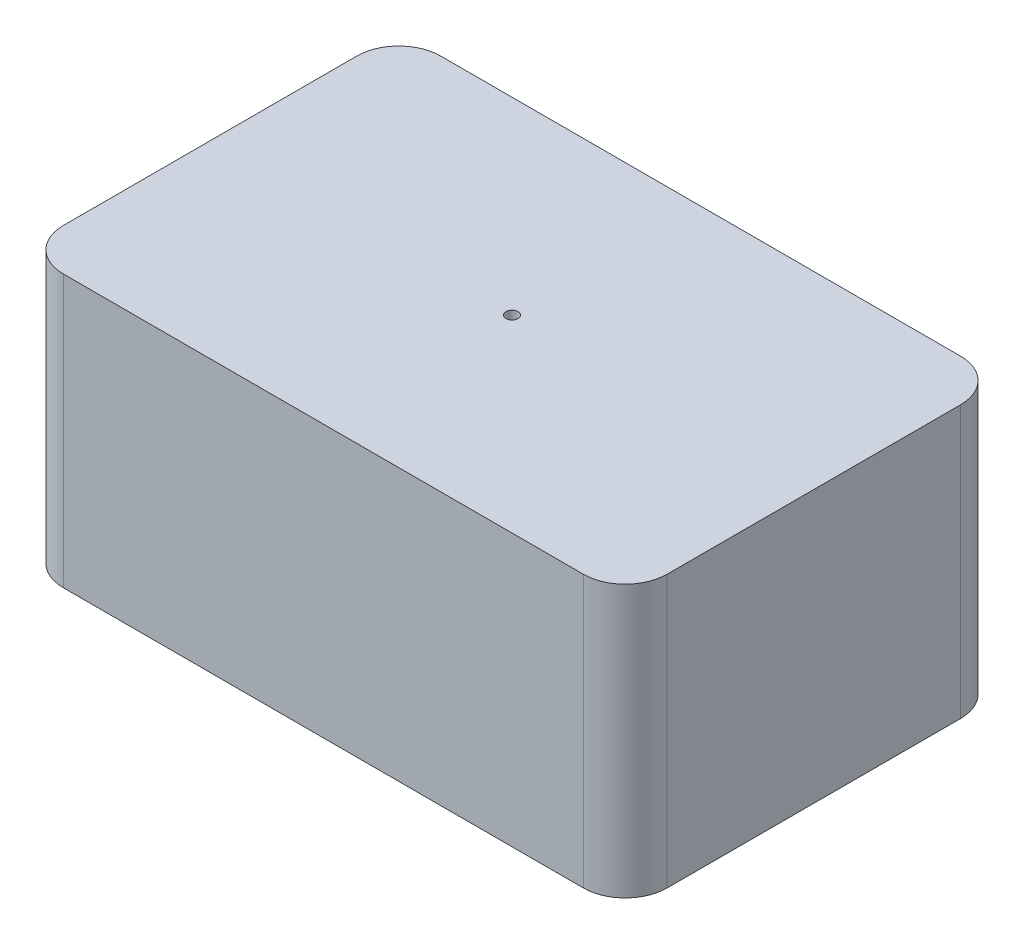
ISO-10303-21;
HEADER;
FILE_DESCRIPTION(('STEP AP214'),'2;1');
FILE_NAME('part.step','',(''),(''),'','','');
FILE_SCHEMA(('AUTOMOTIVE_DESIGN { 1 0 10303 214 1 1 1 1 }'));
ENDSEC;
DATA;
#1=APPLICATION_CONTEXT('core data for automotive mechanical design processes');
#2=APPLICATION_PROTOCOL_DEFINITION('international standard','automotive_design',2000,#1);
#3=PRODUCT_CONTEXT('',#1,'mechanical');
#4=PRODUCT('Part','Part','',(#3));
#5=PRODUCT_RELATED_PRODUCT_CATEGORY('part','',(#4));
#6=PRODUCT_DEFINITION_FORMATION('','',#4);
#7=PRODUCT_DEFINITION_CONTEXT('part definition',#1,'design');
#8=PRODUCT_DEFINITION('design','',#6,#7);
#9=PRODUCT_DEFINITION_SHAPE('','',#8);
#10=(LENGTH_UNIT() NAMED_UNIT(*) SI_UNIT(.MILLI.,.METRE.));
#11=(NAMED_UNIT(*) PLANE_ANGLE_UNIT() SI_UNIT($,.RADIAN.));
#12=(NAMED_UNIT(*) SI_UNIT($,.STERADIAN.) SOLID_ANGLE_UNIT());
#13=UNCERTAINTY_MEASURE_WITH_UNIT(LENGTH_MEASURE(1.E-05),#10,'distance_accuracy_value','');
#14=(GEOMETRIC_REPRESENTATION_CONTEXT(3) GLOBAL_UNCERTAINTY_ASSIGNED_CONTEXT((#13)) GLOBAL_UNIT_ASSIGNED_CONTEXT((#10,
#11,#12)) REPRESENTATION_CONTEXT('',''));
#15=CARTESIAN_POINT('',(0.,0.,0.));
#16=DIRECTION('',(0.,0.,1.));
#17=DIRECTION('',(1.,0.,0.));
#18=AXIS2_PLACEMENT_3D('',#15,#16,#17);
#19=CARTESIAN_POINT('',(0.,18.,0.));
#20=DIRECTION('',(0.,-1.,0.));
#21=DIRECTION('',(0.,0.,-1.));
#22=AXIS2_PLACEMENT_3D('',#19,#20,#21);
#23=CYLINDRICAL_SURFACE('',#22,0.4);
#24=CARTESIAN_POINT('',(0.,18.,0.));
#25=DIRECTION('',(0.,1.,0.));
#26=DIRECTION('',(0.,0.,1.));
#27=AXIS2_PLACEMENT_3D('',#24,#25,#26);
#28=CIRCLE('',#27,0.4);
#29=CARTESIAN_POINT('',(0.,18.,0.4));
#30=VERTEX_POINT('',#29);
#31=EDGE_CURVE('E160',#30,#30,#28,.T.);
#32=ORIENTED_EDGE('',*,*,#31,.T.);
#33=EDGE_LOOP('',(#32));
#34=FACE_BOUND('',#33,.T.);
#35=CARTESIAN_POINT('',(0.,17.,0.));
#36=DIRECTION('',(0.,-1.,0.));
#37=DIRECTION('',(0.,0.,-1.));
#38=AXIS2_PLACEMENT_3D('',#35,#36,#37);
#39=CIRCLE('',#38,0.4);
#40=CARTESIAN_POINT('',(0.,17.,-0.4));
#41=VERTEX_POINT('',#40);
#42=EDGE_CURVE('E43',#41,#41,#39,.T.);
#43=ORIENTED_EDGE('',*,*,#42,.T.);
#44=EDGE_LOOP('',(#43));
#45=FACE_BOUND('',#44,.T.);
#46=ADVANCED_FACE('F39',(#34,#45),#23,.F.);
#47=CARTESIAN_POINT('',(17.2231656762451,18.,-9.72316567624512));
#48=DIRECTION('',(0.,-1.,0.));
#49=DIRECTION('',(0.,0.,-1.));
#50=AXIS2_PLACEMENT_3D('',#47,#48,#49);
#51=PLANE('',#50);
#52=CARTESIAN_POINT('',(17.2231656762451,18.,-9.72316567624512));
#53=DIRECTION('',(0.,1.,0.));
#54=DIRECTION('',(0.,0.,-1.));
#55=AXIS2_PLACEMENT_3D('',#52,#53,#54);
#56=CIRCLE('',#55,2.77683432375488);
#57=CARTESIAN_POINT('',(20.,18.,-9.72316567624512));
#58=VERTEX_POINT('',#57);
#59=CARTESIAN_POINT('',(17.2231656762451,18.,-12.5));
#60=VERTEX_POINT('',#59);
#61=EDGE_CURVE('E179',#58,#60,#56,.T.);
#62=ORIENTED_EDGE('',*,*,#61,.T.);
#63=DIRECTION('',(-1.,0.,0.));
#64=VECTOR('',#63,1.);
#65=CARTESIAN_POINT('',(-17.2231656762451,18.,-12.5));
#66=LINE('',#65,#64);
#67=CARTESIAN_POINT('',(-17.2231656762451,18.,-12.5));
#68=VERTEX_POINT('',#67);
#69=EDGE_CURVE('E106',#60,#68,#66,.T.);
#70=ORIENTED_EDGE('',*,*,#69,.T.);
#71=CARTESIAN_POINT('',(-17.2231656762451,18.,-9.72316567624511));
#72=DIRECTION('',(0.,1.,0.));
#73=DIRECTION('',(0.,0.,1.));
#74=AXIS2_PLACEMENT_3D('',#71,#72,#73);
#75=CIRCLE('',#74,2.77683432375489);
#76=CARTESIAN_POINT('',(-20.,18.,-9.72316567624511));
#77=VERTEX_POINT('',#76);
#78=EDGE_CURVE('E201',#68,#77,#75,.T.);
#79=ORIENTED_EDGE('',*,*,#78,.T.);
#80=DIRECTION('',(0.,0.,1.));
#81=VECTOR('',#80,1.);
#82=CARTESIAN_POINT('',(-20.,18.,-9.72316567624511));
#83=LINE('',#82,#81);
#84=CARTESIAN_POINT('',(-20.,18.,9.72316567624511));
#85=VERTEX_POINT('',#84);
#86=EDGE_CURVE('E214',#77,#85,#83,.T.);
#87=ORIENTED_EDGE('',*,*,#86,.T.);
#88=CARTESIAN_POINT('',(-17.2231656762451,18.,9.72316567624511));
#89=DIRECTION('',(0.,1.,0.));
#90=DIRECTION('',(0.,0.,-1.));
#91=AXIS2_PLACEMENT_3D('',#88,#89,#90);
#92=CIRCLE('',#91,2.77683432375488);
#93=CARTESIAN_POINT('',(-17.2231656762451,18.,12.5));
#94=VERTEX_POINT('',#93);
#95=EDGE_CURVE('E130',#85,#94,#92,.T.);
#96=ORIENTED_EDGE('',*,*,#95,.T.);
#97=DIRECTION('',(1.,0.,0.));
#98=VECTOR('',#97,1.);
#99=CARTESIAN_POINT('',(17.2231656762451,18.,12.5));
#100=LINE('',#99,#98);
#101=CARTESIAN_POINT('',(17.2231656762451,18.,12.5));
#102=VERTEX_POINT('',#101);
#103=EDGE_CURVE('E122',#94,#102,#100,.T.);
#104=ORIENTED_EDGE('',*,*,#103,.T.);
#105=CARTESIAN_POINT('',(17.2231656762451,18.,9.72316567624511));
#106=DIRECTION('',(0.,1.,0.));
#107=DIRECTION('',(0.,0.,1.));
#108=AXIS2_PLACEMENT_3D('',#105,#106,#107);
#109=CIRCLE('',#108,2.77683432375489);
#110=CARTESIAN_POINT('',(20.,18.,9.72316567624511));
#111=VERTEX_POINT('',#110);
#112=EDGE_CURVE('E127',#102,#111,#109,.T.);
#113=ORIENTED_EDGE('',*,*,#112,.T.);
#114=DIRECTION('',(0.,0.,-1.));
#115=VECTOR('',#114,1.);
#116=CARTESIAN_POINT('',(20.,18.,-9.72316567624512));
#117=LINE('',#116,#115);
#118=EDGE_CURVE('E65',#111,#58,#117,.T.);
#119=ORIENTED_EDGE('',*,*,#118,.T.);
#120=EDGE_LOOP('',(#62,#70,#79,#87,#96,#104,#113,#119));
#121=FACE_BOUND('',#120,.T.);
#122=ORIENTED_EDGE('',*,*,#31,.F.);
#123=EDGE_LOOP('',(#122));
#124=FACE_BOUND('',#123,.T.);
#125=ADVANCED_FACE('F124',(#121,#124),#51,.F.);
#126=CARTESIAN_POINT('',(17.2231656762451,0.,-9.72316567624512));
#127=DIRECTION('',(0.,-1.,0.));
#128=DIRECTION('',(0.,0.,-1.));
#129=AXIS2_PLACEMENT_3D('',#126,#127,#128);
#130=PLANE('',#129);
#131=DIRECTION('',(1.,0.,0.));
#132=VECTOR('',#131,1.);
#133=CARTESIAN_POINT('',(-17.2231656762451,0.,-11.5));
#134=LINE('',#133,#132);
#135=CARTESIAN_POINT('',(-17.2231656762451,0.,-11.5));
#136=VERTEX_POINT('',#135);
#137=CARTESIAN_POINT('',(17.2231656762451,0.,-11.5));
#138=VERTEX_POINT('',#137);
#139=EDGE_CURVE('E56',#136,#138,#134,.T.);
#140=ORIENTED_EDGE('',*,*,#139,.F.);
#141=CARTESIAN_POINT('',(-17.2231656762451,0.,-9.72316567624511));
#142=DIRECTION('',(0.,-1.,0.));
#143=DIRECTION('',(0.,0.,-1.));
#144=AXIS2_PLACEMENT_3D('',#141,#142,#143);
#145=CIRCLE('',#144,1.77683432375489);
#146=CARTESIAN_POINT('',(-19.,0.,-9.72316567624511));
#147=VERTEX_POINT('',#146);
#148=EDGE_CURVE('E258',#147,#136,#145,.T.);
#149=ORIENTED_EDGE('',*,*,#148,.F.);
#150=DIRECTION('',(0.,0.,-1.));
#151=VECTOR('',#150,1.);
#152=CARTESIAN_POINT('',(-19.,0.,9.72316567624511));
#153=LINE('',#152,#151);
#154=CARTESIAN_POINT('',(-19.,0.,9.72316567624511));
#155=VERTEX_POINT('',#154);
#156=EDGE_CURVE('E263',#155,#147,#153,.T.);
#157=ORIENTED_EDGE('',*,*,#156,.F.);
#158=CARTESIAN_POINT('',(-17.2231656762451,0.,9.72316567624511));
#159=DIRECTION('',(0.,-1.,0.));
#160=DIRECTION('',(0.,0.,-1.));
#161=AXIS2_PLACEMENT_3D('',#158,#159,#160);
#162=CIRCLE('',#161,1.77683432375489);
#163=CARTESIAN_POINT('',(-17.2231656762451,0.,11.5));
#164=VERTEX_POINT('',#163);
#165=EDGE_CURVE('E267',#164,#155,#162,.T.);
#166=ORIENTED_EDGE('',*,*,#165,.F.);
#167=DIRECTION('',(-1.,0.,0.));
#168=VECTOR('',#167,1.);
#169=CARTESIAN_POINT('',(17.2231656762451,0.,11.5));
#170=LINE('',#169,#168);
#171=CARTESIAN_POINT('',(17.2231656762451,0.,11.5));
#172=VERTEX_POINT('',#171);
#173=EDGE_CURVE('E271',#172,#164,#170,.T.);
#174=ORIENTED_EDGE('',*,*,#173,.F.);
#175=CARTESIAN_POINT('',(17.2231656762451,0.,9.72316567624511));
#176=DIRECTION('',(0.,-1.,0.));
#177=DIRECTION('',(0.,0.,-1.));
#178=AXIS2_PLACEMENT_3D('',#175,#176,#177);
#179=CIRCLE('',#178,1.77683432375488);
#180=CARTESIAN_POINT('',(19.,0.,9.72316567624511));
#181=VERTEX_POINT('',#180);
#182=EDGE_CURVE('E275',#181,#172,#179,.T.);
#183=ORIENTED_EDGE('',*,*,#182,.F.);
#184=DIRECTION('',(0.,0.,1.));
#185=VECTOR('',#184,1.);
#186=CARTESIAN_POINT('',(19.,0.,-9.72316567624512));
#187=LINE('',#186,#185);
#188=CARTESIAN_POINT('',(19.,0.,-9.72316567624512));
#189=VERTEX_POINT('',#188);
#190=EDGE_CURVE('E279',#189,#181,#187,.T.);
#191=ORIENTED_EDGE('',*,*,#190,.F.);
#192=CARTESIAN_POINT('',(17.2231656762451,0.,-9.72316567624512));
#193=DIRECTION('',(0.,-1.,0.));
#194=DIRECTION('',(0.,0.,-1.));
#195=AXIS2_PLACEMENT_3D('',#192,#193,#194);
#196=CIRCLE('',#195,1.77683432375488);
#197=EDGE_CURVE('E283',#138,#189,#196,.T.);
#198=ORIENTED_EDGE('',*,*,#197,.F.);
#199=EDGE_LOOP('',(#140,#149,#157,#166,#174,#183,#191,#198));
#200=FACE_BOUND('',#199,.T.);
#201=CARTESIAN_POINT('',(17.2231656762451,0.,-9.72316567624512));
#202=DIRECTION('',(0.,1.,0.));
#203=DIRECTION('',(0.,0.,-1.));
#204=AXIS2_PLACEMENT_3D('',#201,#202,#203);
#205=CIRCLE('',#204,2.77683432375488);
#206=CARTESIAN_POINT('',(20.,0.,-9.72316567624512));
#207=VERTEX_POINT('',#206);
#208=CARTESIAN_POINT('',(17.2231656762451,0.,-12.5));
#209=VERTEX_POINT('',#208);
#210=EDGE_CURVE('E155',#207,#209,#205,.T.);
#211=ORIENTED_EDGE('',*,*,#210,.F.);
#212=DIRECTION('',(0.,0.,-1.));
#213=VECTOR('',#212,1.);
#214=CARTESIAN_POINT('',(20.,0.,-9.72316567624512));
#215=LINE('',#214,#213);
#216=CARTESIAN_POINT('',(20.,0.,9.72316567624511));
#217=VERTEX_POINT('',#216);
#218=EDGE_CURVE('E98',#217,#207,#215,.T.);
#219=ORIENTED_EDGE('',*,*,#218,.F.);
#220=CARTESIAN_POINT('',(17.2231656762451,0.,9.72316567624511));
#221=DIRECTION('',(0.,1.,0.));
#222=DIRECTION('',(0.,0.,1.));
#223=AXIS2_PLACEMENT_3D('',#220,#221,#222);
#224=CIRCLE('',#223,2.77683432375489);
#225=CARTESIAN_POINT('',(17.2231656762451,0.,12.5));
#226=VERTEX_POINT('',#225);
#227=EDGE_CURVE('E174',#226,#217,#224,.T.);
#228=ORIENTED_EDGE('',*,*,#227,.F.);
#229=DIRECTION('',(1.,0.,0.));
#230=VECTOR('',#229,1.);
#231=CARTESIAN_POINT('',(17.2231656762451,0.,12.5));
#232=LINE('',#231,#230);
#233=CARTESIAN_POINT('',(-17.2231656762451,0.,12.5));
#234=VERTEX_POINT('',#233);
#235=EDGE_CURVE('E140',#234,#226,#232,.T.);
#236=ORIENTED_EDGE('',*,*,#235,.F.);
#237=CARTESIAN_POINT('',(-17.2231656762451,0.,9.72316567624511));
#238=DIRECTION('',(0.,1.,0.));
#239=DIRECTION('',(0.,0.,-1.));
#240=AXIS2_PLACEMENT_3D('',#237,#238,#239);
#241=CIRCLE('',#240,2.77683432375488);
#242=CARTESIAN_POINT('',(-20.,0.,9.72316567624511));
#243=VERTEX_POINT('',#242);
#244=EDGE_CURVE('E169',#243,#234,#241,.T.);
#245=ORIENTED_EDGE('',*,*,#244,.F.);
#246=DIRECTION('',(0.,0.,1.));
#247=VECTOR('',#246,1.);
#248=CARTESIAN_POINT('',(-20.,0.,-9.72316567624511));
#249=LINE('',#248,#247);
#250=CARTESIAN_POINT('',(-20.,0.,-9.72316567624511));
#251=VERTEX_POINT('',#250);
#252=EDGE_CURVE('E166',#251,#243,#249,.T.);
#253=ORIENTED_EDGE('',*,*,#252,.F.);
#254=CARTESIAN_POINT('',(-17.2231656762451,0.,-9.72316567624511));
#255=DIRECTION('',(0.,1.,0.));
#256=DIRECTION('',(0.,0.,1.));
#257=AXIS2_PLACEMENT_3D('',#254,#255,#256);
#258=CIRCLE('',#257,2.77683432375489);
#259=CARTESIAN_POINT('',(-17.2231656762451,0.,-12.5));
#260=VERTEX_POINT('',#259);
#261=EDGE_CURVE('E163',#260,#251,#258,.T.);
#262=ORIENTED_EDGE('',*,*,#261,.F.);
#263=DIRECTION('',(-1.,0.,0.));
#264=VECTOR('',#263,1.);
#265=CARTESIAN_POINT('',(-17.2231656762451,0.,-12.5));
#266=LINE('',#265,#264);
#267=EDGE_CURVE('E159',#209,#260,#266,.T.);
#268=ORIENTED_EDGE('',*,*,#267,.F.);
#269=EDGE_LOOP('',(#211,#219,#228,#236,#245,#253,#262,#268));
#270=FACE_BOUND('',#269,.T.);
#271=ADVANCED_FACE('F205',(#200,#270),#130,.T.);
#272=CARTESIAN_POINT('',(17.2231656762451,18.,-9.72316567624512));
#273=DIRECTION('',(0.,-1.,0.));
#274=DIRECTION('',(0.,0.,-1.));
#275=AXIS2_PLACEMENT_3D('',#272,#273,#274);
#276=CYLINDRICAL_SURFACE('',#275,2.77683432375488);
#277=ORIENTED_EDGE('',*,*,#210,.T.);
#278=DIRECTION('',(0.,-1.,0.));
#279=VECTOR('',#278,1.);
#280=CARTESIAN_POINT('',(17.2231656762451,18.,-12.5));
#281=LINE('',#280,#279);
#282=EDGE_CURVE('E11',#60,#209,#281,.T.);
#283=ORIENTED_EDGE('',*,*,#282,.F.);
#284=ORIENTED_EDGE('',*,*,#61,.F.);
#285=DIRECTION('',(0.,-1.,0.));
#286=VECTOR('',#285,1.);
#287=CARTESIAN_POINT('',(20.,18.,-9.72316567624512));
#288=LINE('',#287,#286);
#289=EDGE_CURVE('E151',#58,#207,#288,.T.);
#290=ORIENTED_EDGE('',*,*,#289,.T.);
#291=EDGE_LOOP('',(#277,#283,#284,#290));
#292=FACE_BOUND('',#291,.T.);
#293=ADVANCED_FACE('F41',(#292),#276,.T.);
#294=CARTESIAN_POINT('',(-17.2231656762451,18.,-12.5));
#295=DIRECTION('',(0.,0.,1.));
#296=DIRECTION('',(1.,0.,0.));
#297=AXIS2_PLACEMENT_3D('',#294,#295,#296);
#298=PLANE('',#297);
#299=ORIENTED_EDGE('',*,*,#267,.T.);
#300=DIRECTION('',(0.,-1.,0.));
#301=VECTOR('',#300,1.);
#302=CARTESIAN_POINT('',(-17.2231656762451,18.,-12.5));
#303=LINE('',#302,#301);
#304=EDGE_CURVE('E49',#68,#260,#303,.T.);
#305=ORIENTED_EDGE('',*,*,#304,.F.);
#306=ORIENTED_EDGE('',*,*,#69,.F.);
#307=ORIENTED_EDGE('',*,*,#282,.T.);
#308=EDGE_LOOP('',(#299,#305,#306,#307));
#309=FACE_BOUND('',#308,.T.);
#310=ADVANCED_FACE('F417',(#309),#298,.F.);
#311=CARTESIAN_POINT('',(-17.2231656762451,18.,-9.72316567624511));
#312=DIRECTION('',(0.,-1.,0.));
#313=DIRECTION('',(0.,0.,-1.));
#314=AXIS2_PLACEMENT_3D('',#311,#312,#313);
#315=CYLINDRICAL_SURFACE('',#314,2.77683432375489);
#316=ORIENTED_EDGE('',*,*,#261,.T.);
#317=DIRECTION('',(0.,-1.,0.));
#318=VECTOR('',#317,1.);
#319=CARTESIAN_POINT('',(-20.,18.,-9.72316567624511));
#320=LINE('',#319,#318);
#321=EDGE_CURVE('E190',#77,#251,#320,.T.);
#322=ORIENTED_EDGE('',*,*,#321,.F.);
#323=ORIENTED_EDGE('',*,*,#78,.F.);
#324=ORIENTED_EDGE('',*,*,#304,.T.);
#325=EDGE_LOOP('',(#316,#322,#323,#324));
#326=FACE_BOUND('',#325,.T.);
#327=ADVANCED_FACE('F199',(#326),#315,.T.);
#328=CARTESIAN_POINT('',(-20.,18.,-9.72316567624511));
#329=DIRECTION('',(1.,0.,0.));
#330=DIRECTION('',(0.,0.,-1.));
#331=AXIS2_PLACEMENT_3D('',#328,#329,#330);
#332=PLANE('',#331);
#333=ORIENTED_EDGE('',*,*,#252,.T.);
#334=DIRECTION('',(0.,-1.,0.));
#335=VECTOR('',#334,1.);
#336=CARTESIAN_POINT('',(-20.,18.,9.72316567624511));
#337=LINE('',#336,#335);
#338=EDGE_CURVE('E186',#85,#243,#337,.T.);
#339=ORIENTED_EDGE('',*,*,#338,.F.);
#340=ORIENTED_EDGE('',*,*,#86,.F.);
#341=ORIENTED_EDGE('',*,*,#321,.T.);
#342=EDGE_LOOP('',(#333,#339,#340,#341));
#343=FACE_BOUND('',#342,.T.);
#344=ADVANCED_FACE('F209',(#343),#332,.F.);
#345=CARTESIAN_POINT('',(-17.2231656762451,18.,9.72316567624511));
#346=DIRECTION('',(0.,-1.,0.));
#347=DIRECTION('',(0.,0.,-1.));
#348=AXIS2_PLACEMENT_3D('',#345,#346,#347);
#349=CYLINDRICAL_SURFACE('',#348,2.77683432375488);
#350=ORIENTED_EDGE('',*,*,#244,.T.);
#351=DIRECTION('',(0.,-1.,0.));
#352=VECTOR('',#351,1.);
#353=CARTESIAN_POINT('',(-17.2231656762451,18.,12.5));
#354=LINE('',#353,#352);
#355=EDGE_CURVE('E144',#94,#234,#354,.T.);
#356=ORIENTED_EDGE('',*,*,#355,.F.);
#357=ORIENTED_EDGE('',*,*,#95,.F.);
#358=ORIENTED_EDGE('',*,*,#338,.T.);
#359=EDGE_LOOP('',(#350,#356,#357,#358));
#360=FACE_BOUND('',#359,.T.);
#361=ADVANCED_FACE('F212',(#360),#349,.T.);
#362=CARTESIAN_POINT('',(17.2231656762451,18.,12.5));
#363=DIRECTION('',(0.,0.,-1.));
#364=DIRECTION('',(-1.,0.,0.));
#365=AXIS2_PLACEMENT_3D('',#362,#363,#364);
#366=PLANE('',#365);
#367=ORIENTED_EDGE('',*,*,#235,.T.);
#368=DIRECTION('',(0.,-1.,0.));
#369=VECTOR('',#368,1.);
#370=CARTESIAN_POINT('',(17.2231656762451,18.,12.5));
#371=LINE('',#370,#369);
#372=EDGE_CURVE('E137',#102,#226,#371,.T.);
#373=ORIENTED_EDGE('',*,*,#372,.F.);
#374=ORIENTED_EDGE('',*,*,#103,.F.);
#375=ORIENTED_EDGE('',*,*,#355,.T.);
#376=EDGE_LOOP('',(#367,#373,#374,#375));
#377=FACE_BOUND('',#376,.T.);
#378=ADVANCED_FACE('F138',(#377),#366,.F.);
#379=CARTESIAN_POINT('',(17.2231656762451,18.,9.72316567624511));
#380=DIRECTION('',(0.,-1.,0.));
#381=DIRECTION('',(0.,0.,-1.));
#382=AXIS2_PLACEMENT_3D('',#379,#380,#381);
#383=CYLINDRICAL_SURFACE('',#382,2.77683432375489);
#384=ORIENTED_EDGE('',*,*,#227,.T.);
#385=DIRECTION('',(0.,-1.,0.));
#386=VECTOR('',#385,1.);
#387=CARTESIAN_POINT('',(20.,18.,9.72316567624511));
#388=LINE('',#387,#386);
#389=EDGE_CURVE('E145',#111,#217,#388,.T.);
#390=ORIENTED_EDGE('',*,*,#389,.F.);
#391=ORIENTED_EDGE('',*,*,#112,.F.);
#392=ORIENTED_EDGE('',*,*,#372,.T.);
#393=EDGE_LOOP('',(#384,#390,#391,#392));
#394=FACE_BOUND('',#393,.T.);
#395=ADVANCED_FACE('F147',(#394),#383,.T.);
#396=CARTESIAN_POINT('',(20.,18.,-9.72316567624512));
#397=DIRECTION('',(-1.,0.,0.));
#398=DIRECTION('',(0.,0.,1.));
#399=AXIS2_PLACEMENT_3D('',#396,#397,#398);
#400=PLANE('',#399);
#401=ORIENTED_EDGE('',*,*,#218,.T.);
#402=ORIENTED_EDGE('',*,*,#289,.F.);
#403=ORIENTED_EDGE('',*,*,#118,.F.);
#404=ORIENTED_EDGE('',*,*,#389,.T.);
#405=EDGE_LOOP('',(#401,#402,#403,#404));
#406=FACE_BOUND('',#405,.T.);
#407=ADVANCED_FACE('F405',(#406),#400,.F.);
#408=CARTESIAN_POINT('',(-17.2231656762451,17.,-11.5));
#409=DIRECTION('',(0.,0.,-1.));
#410=DIRECTION('',(-1.,0.,0.));
#411=AXIS2_PLACEMENT_3D('',#408,#409,#410);
#412=PLANE('',#411);
#413=ORIENTED_EDGE('',*,*,#139,.T.);
#414=DIRECTION('',(0.,-1.,0.));
#415=VECTOR('',#414,1.);
#416=CARTESIAN_POINT('',(17.2231656762451,17.,-11.5));
#417=LINE('',#416,#415);
#418=CARTESIAN_POINT('',(17.2231656762451,17.,-11.5));
#419=VERTEX_POINT('',#418);
#420=EDGE_CURVE('E227',#419,#138,#417,.T.);
#421=ORIENTED_EDGE('',*,*,#420,.F.);
#422=DIRECTION('',(1.,0.,0.));
#423=VECTOR('',#422,1.);
#424=CARTESIAN_POINT('',(-17.2231656762451,17.,-11.5));
#425=LINE('',#424,#423);
#426=CARTESIAN_POINT('',(-17.2231656762451,17.,-11.5));
#427=VERTEX_POINT('',#426);
#428=EDGE_CURVE('E262',#427,#419,#425,.T.);
#429=ORIENTED_EDGE('',*,*,#428,.F.);
#430=DIRECTION('',(0.,-1.,0.));
#431=VECTOR('',#430,1.);
#432=CARTESIAN_POINT('',(-17.2231656762451,17.,-11.5));
#433=LINE('',#432,#431);
#434=EDGE_CURVE('E255',#427,#136,#433,.T.);
#435=ORIENTED_EDGE('',*,*,#434,.T.);
#436=EDGE_LOOP('',(#413,#421,#429,#435));
#437=FACE_BOUND('',#436,.T.);
#438=ADVANCED_FACE('F326',(#437),#412,.F.);
#439=CARTESIAN_POINT('',(-17.2231656762451,17.,-9.72316567624511));
#440=DIRECTION('',(0.,-1.,0.));
#441=DIRECTION('',(0.,0.,-1.));
#442=AXIS2_PLACEMENT_3D('',#439,#440,#441);
#443=CYLINDRICAL_SURFACE('',#442,1.77683432375489);
#444=ORIENTED_EDGE('',*,*,#148,.T.);
#445=ORIENTED_EDGE('',*,*,#434,.F.);
#446=CARTESIAN_POINT('',(-17.2231656762451,17.,-9.72316567624511));
#447=DIRECTION('',(0.,-1.,0.));
#448=DIRECTION('',(0.,0.,-1.));
#449=AXIS2_PLACEMENT_3D('',#446,#447,#448);
#450=CIRCLE('',#449,1.77683432375489);
#451=CARTESIAN_POINT('',(-19.,17.,-9.72316567624511));
#452=VERTEX_POINT('',#451);
#453=EDGE_CURVE('E231',#452,#427,#450,.T.);
#454=ORIENTED_EDGE('',*,*,#453,.F.);
#455=DIRECTION('',(0.,-1.,0.));
#456=VECTOR('',#455,1.);
#457=CARTESIAN_POINT('',(-19.,17.,-9.72316567624511));
#458=LINE('',#457,#456);
#459=EDGE_CURVE('E251',#452,#147,#458,.T.);
#460=ORIENTED_EDGE('',*,*,#459,.T.);
#461=EDGE_LOOP('',(#444,#445,#454,#460));
#462=FACE_BOUND('',#461,.T.);
#463=ADVANCED_FACE('F346',(#462),#443,.F.);
#464=CARTESIAN_POINT('',(-19.,17.,9.72316567624511));
#465=DIRECTION('',(-1.,0.,0.));
#466=DIRECTION('',(0.,0.,1.));
#467=AXIS2_PLACEMENT_3D('',#464,#465,#466);
#468=PLANE('',#467);
#469=ORIENTED_EDGE('',*,*,#156,.T.);
#470=ORIENTED_EDGE('',*,*,#459,.F.);
#471=DIRECTION('',(0.,0.,-1.));
#472=VECTOR('',#471,1.);
#473=CARTESIAN_POINT('',(-19.,17.,9.72316567624511));
#474=LINE('',#473,#472);
#475=CARTESIAN_POINT('',(-19.,17.,9.72316567624511));
#476=VERTEX_POINT('',#475);
#477=EDGE_CURVE('E292',#476,#452,#474,.T.);
#478=ORIENTED_EDGE('',*,*,#477,.F.);
#479=DIRECTION('',(0.,-1.,0.));
#480=VECTOR('',#479,1.);
#481=CARTESIAN_POINT('',(-19.,17.,9.72316567624511));
#482=LINE('',#481,#480);
#483=EDGE_CURVE('E247',#476,#155,#482,.T.);
#484=ORIENTED_EDGE('',*,*,#483,.T.);
#485=EDGE_LOOP('',(#469,#470,#478,#484));
#486=FACE_BOUND('',#485,.T.);
#487=ADVANCED_FACE('F351',(#486),#468,.F.);
#488=CARTESIAN_POINT('',(-17.2231656762451,17.,9.72316567624511));
#489=DIRECTION('',(0.,-1.,0.));
#490=DIRECTION('',(0.,0.,-1.));
#491=AXIS2_PLACEMENT_3D('',#488,#489,#490);
#492=CYLINDRICAL_SURFACE('',#491,1.77683432375489);
#493=ORIENTED_EDGE('',*,*,#165,.T.);
#494=ORIENTED_EDGE('',*,*,#483,.F.);
#495=CARTESIAN_POINT('',(-17.2231656762451,17.,9.72316567624511));
#496=DIRECTION('',(0.,-1.,0.));
#497=DIRECTION('',(0.,0.,-1.));
#498=AXIS2_PLACEMENT_3D('',#495,#496,#497);
#499=CIRCLE('',#498,1.77683432375489);
#500=CARTESIAN_POINT('',(-17.2231656762451,17.,11.5));
#501=VERTEX_POINT('',#500);
#502=EDGE_CURVE('E296',#501,#476,#499,.T.);
#503=ORIENTED_EDGE('',*,*,#502,.F.);
#504=DIRECTION('',(0.,-1.,0.));
#505=VECTOR('',#504,1.);
#506=CARTESIAN_POINT('',(-17.2231656762451,17.,11.5));
#507=LINE('',#506,#505);
#508=EDGE_CURVE('E243',#501,#164,#507,.T.);
#509=ORIENTED_EDGE('',*,*,#508,.T.);
#510=EDGE_LOOP('',(#493,#494,#503,#509));
#511=FACE_BOUND('',#510,.T.);
#512=ADVANCED_FACE('F377',(#511),#492,.F.);
#513=CARTESIAN_POINT('',(17.2231656762451,17.,11.5));
#514=DIRECTION('',(0.,0.,1.));
#515=DIRECTION('',(1.,0.,0.));
#516=AXIS2_PLACEMENT_3D('',#513,#514,#515);
#517=PLANE('',#516);
#518=ORIENTED_EDGE('',*,*,#173,.T.);
#519=ORIENTED_EDGE('',*,*,#508,.F.);
#520=DIRECTION('',(-1.,0.,0.));
#521=VECTOR('',#520,1.);
#522=CARTESIAN_POINT('',(17.2231656762451,17.,11.5));
#523=LINE('',#522,#521);
#524=CARTESIAN_POINT('',(17.2231656762451,17.,11.5));
#525=VERTEX_POINT('',#524);
#526=EDGE_CURVE('E300',#525,#501,#523,.T.);
#527=ORIENTED_EDGE('',*,*,#526,.F.);
#528=DIRECTION('',(0.,-1.,0.));
#529=VECTOR('',#528,1.);
#530=CARTESIAN_POINT('',(17.2231656762451,17.,11.5));
#531=LINE('',#530,#529);
#532=EDGE_CURVE('E239',#525,#172,#531,.T.);
#533=ORIENTED_EDGE('',*,*,#532,.T.);
#534=EDGE_LOOP('',(#518,#519,#527,#533));
#535=FACE_BOUND('',#534,.T.);
#536=ADVANCED_FACE('F380',(#535),#517,.F.);
#537=CARTESIAN_POINT('',(17.2231656762451,17.,9.72316567624511));
#538=DIRECTION('',(0.,-1.,0.));
#539=DIRECTION('',(0.,0.,-1.));
#540=AXIS2_PLACEMENT_3D('',#537,#538,#539);
#541=CYLINDRICAL_SURFACE('',#540,1.77683432375488);
#542=ORIENTED_EDGE('',*,*,#182,.T.);
#543=ORIENTED_EDGE('',*,*,#532,.F.);
#544=CARTESIAN_POINT('',(17.2231656762451,17.,9.72316567624511));
#545=DIRECTION('',(0.,-1.,0.));
#546=DIRECTION('',(0.,0.,-1.));
#547=AXIS2_PLACEMENT_3D('',#544,#545,#546);
#548=CIRCLE('',#547,1.77683432375488);
#549=CARTESIAN_POINT('',(19.,17.,9.72316567624511));
#550=VERTEX_POINT('',#549);
#551=EDGE_CURVE('E304',#550,#525,#548,.T.);
#552=ORIENTED_EDGE('',*,*,#551,.F.);
#553=DIRECTION('',(0.,-1.,0.));
#554=VECTOR('',#553,1.);
#555=CARTESIAN_POINT('',(19.,17.,9.72316567624511));
#556=LINE('',#555,#554);
#557=EDGE_CURVE('E235',#550,#181,#556,.T.);
#558=ORIENTED_EDGE('',*,*,#557,.T.);
#559=EDGE_LOOP('',(#542,#543,#552,#558));
#560=FACE_BOUND('',#559,.T.);
#561=ADVANCED_FACE('F383',(#560),#541,.F.);
#562=CARTESIAN_POINT('',(19.,17.,-9.72316567624512));
#563=DIRECTION('',(1.,0.,0.));
#564=DIRECTION('',(0.,0.,-1.));
#565=AXIS2_PLACEMENT_3D('',#562,#563,#564);
#566=PLANE('',#565);
#567=ORIENTED_EDGE('',*,*,#190,.T.);
#568=ORIENTED_EDGE('',*,*,#557,.F.);
#569=DIRECTION('',(0.,0.,1.));
#570=VECTOR('',#569,1.);
#571=CARTESIAN_POINT('',(19.,17.,-9.72316567624512));
#572=LINE('',#571,#570);
#573=CARTESIAN_POINT('',(19.,17.,-9.72316567624512));
#574=VERTEX_POINT('',#573);
#575=EDGE_CURVE('E308',#574,#550,#572,.T.);
#576=ORIENTED_EDGE('',*,*,#575,.F.);
#577=DIRECTION('',(0.,-1.,0.));
#578=VECTOR('',#577,1.);
#579=CARTESIAN_POINT('',(19.,17.,-9.72316567624512));
#580=LINE('',#579,#578);
#581=EDGE_CURVE('E230',#574,#189,#580,.T.);
#582=ORIENTED_EDGE('',*,*,#581,.T.);
#583=EDGE_LOOP('',(#567,#568,#576,#582));
#584=FACE_BOUND('',#583,.T.);
#585=ADVANCED_FACE('F366',(#584),#566,.F.);
#586=CARTESIAN_POINT('',(17.2231656762451,17.,-9.72316567624512));
#587=DIRECTION('',(0.,-1.,0.));
#588=DIRECTION('',(0.,0.,-1.));
#589=AXIS2_PLACEMENT_3D('',#586,#587,#588);
#590=CYLINDRICAL_SURFACE('',#589,1.77683432375488);
#591=ORIENTED_EDGE('',*,*,#197,.T.);
#592=ORIENTED_EDGE('',*,*,#581,.F.);
#593=CARTESIAN_POINT('',(17.2231656762451,17.,-9.72316567624512));
#594=DIRECTION('',(0.,-1.,0.));
#595=DIRECTION('',(0.,0.,-1.));
#596=AXIS2_PLACEMENT_3D('',#593,#594,#595);
#597=CIRCLE('',#596,1.77683432375488);
#598=EDGE_CURVE('E312',#419,#574,#597,.T.);
#599=ORIENTED_EDGE('',*,*,#598,.F.);
#600=ORIENTED_EDGE('',*,*,#420,.T.);
#601=EDGE_LOOP('',(#591,#592,#599,#600));
#602=FACE_BOUND('',#601,.T.);
#603=ADVANCED_FACE('F360',(#602),#590,.F.);
#604=CARTESIAN_POINT('',(17.2231656762451,17.,-9.72316567624512));
#605=DIRECTION('',(0.,-1.,0.));
#606=DIRECTION('',(0.,0.,-1.));
#607=AXIS2_PLACEMENT_3D('',#604,#605,#606);
#608=PLANE('',#607);
#609=ORIENTED_EDGE('',*,*,#42,.F.);
#610=EDGE_LOOP('',(#609));
#611=FACE_BOUND('',#610,.T.);
#612=ORIENTED_EDGE('',*,*,#428,.T.);
#613=ORIENTED_EDGE('',*,*,#598,.T.);
#614=ORIENTED_EDGE('',*,*,#575,.T.);
#615=ORIENTED_EDGE('',*,*,#551,.T.);
#616=ORIENTED_EDGE('',*,*,#526,.T.);
#617=ORIENTED_EDGE('',*,*,#502,.T.);
#618=ORIENTED_EDGE('',*,*,#477,.T.);
#619=ORIENTED_EDGE('',*,*,#453,.T.);
#620=EDGE_LOOP('',(#612,#613,#614,#615,#616,#617,#618,#619));
#621=FACE_BOUND('',#620,.T.);
#622=ADVANCED_FACE('F321',(#611,#621),#608,.T.);
#623=CLOSED_SHELL('',(#46,#125,#271,#293,#310,#327,#344,#361,#378,#395,#407,#438,#463,#487,#512,
#536,#561,#585,#603,#622));
#624=MANIFOLD_SOLID_BREP('B2',#623);
#625=ADVANCED_BREP_SHAPE_REPRESENTATION('',(#18,#624),#14);
#626=SHAPE_DEFINITION_REPRESENTATION(#9,#625);
ENDSEC;
END-ISO-10303-21;
